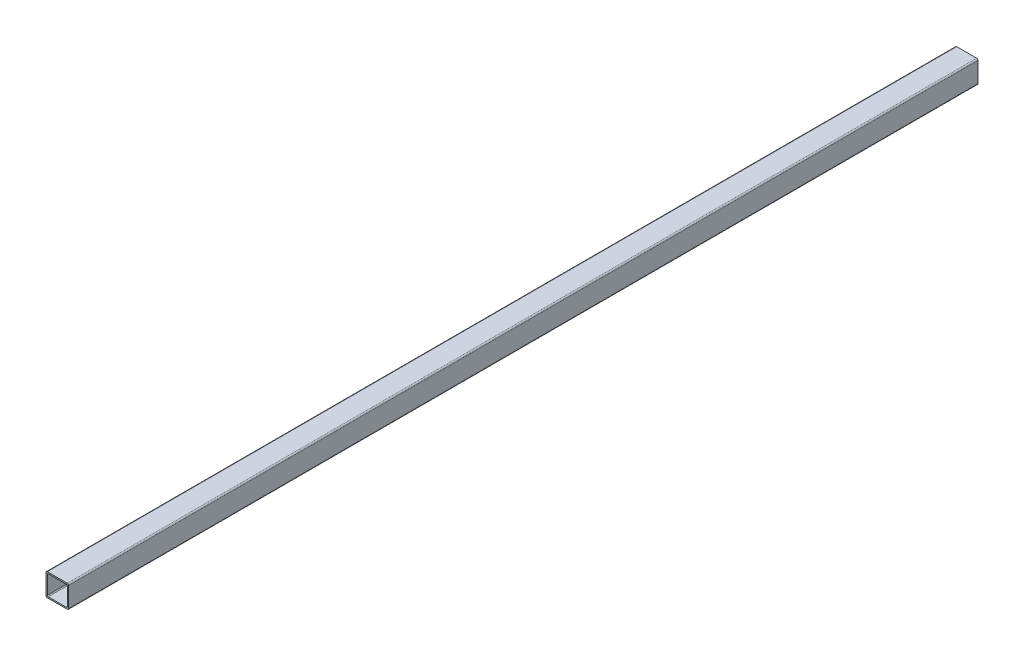
ISO-10303-21;
HEADER;
FILE_DESCRIPTION(('STEP AP214'),'2;1');
FILE_NAME('part.step','',(''),(''),'','','');
FILE_SCHEMA(('AUTOMOTIVE_DESIGN { 1 0 10303 214 1 1 1 1 }'));
ENDSEC;
DATA;
#1=APPLICATION_CONTEXT('core data for automotive mechanical design processes');
#2=APPLICATION_PROTOCOL_DEFINITION('international standard','automotive_design',2000,#1);
#3=PRODUCT_CONTEXT('',#1,'mechanical');
#4=PRODUCT('Part','Part','',(#3));
#5=PRODUCT_RELATED_PRODUCT_CATEGORY('part','',(#4));
#6=PRODUCT_DEFINITION_FORMATION('','',#4);
#7=PRODUCT_DEFINITION_CONTEXT('part definition',#1,'design');
#8=PRODUCT_DEFINITION('design','',#6,#7);
#9=PRODUCT_DEFINITION_SHAPE('','',#8);
#10=(LENGTH_UNIT() NAMED_UNIT(*) SI_UNIT(.MILLI.,.METRE.));
#11=(NAMED_UNIT(*) PLANE_ANGLE_UNIT() SI_UNIT($,.RADIAN.));
#12=(NAMED_UNIT(*) SI_UNIT($,.STERADIAN.) SOLID_ANGLE_UNIT());
#13=UNCERTAINTY_MEASURE_WITH_UNIT(LENGTH_MEASURE(1.E-05),#10,'distance_accuracy_value','');
#14=(GEOMETRIC_REPRESENTATION_CONTEXT(3) GLOBAL_UNCERTAINTY_ASSIGNED_CONTEXT((#13)) GLOBAL_UNIT_ASSIGNED_CONTEXT((#10,
#11,#12)) REPRESENTATION_CONTEXT('',''));
#15=CARTESIAN_POINT('',(0.,0.,0.));
#16=DIRECTION('',(0.,0.,1.));
#17=DIRECTION('',(1.,0.,0.));
#18=AXIS2_PLACEMENT_3D('',#15,#16,#17);
#19=CARTESIAN_POINT('',(-8.88178419700125E-13,93.9999999999994,4161.70432876125));
#20=DIRECTION('',(1.,0.,0.));
#21=DIRECTION('',(0.,0.,-1.));
#22=AXIS2_PLACEMENT_3D('',#19,#20,#21);
#23=PLANE('',#22);
#24=DIRECTION('',(0.,-1.,0.));
#25=VECTOR('',#24,1.);
#26=CARTESIAN_POINT('',(-8.88178419700125E-13,93.9999999999994,4020.28297252394));
#27=LINE('',#26,#25);
#28=CARTESIAN_POINT('',(-8.88178419700125E-13,93.9999999999994,4020.28297252394));
#29=VERTEX_POINT('',#28);
#30=CARTESIAN_POINT('',(-8.88178419700125E-13,5.99999999999945,4020.28297252394));
#31=VERTEX_POINT('',#30);
#32=EDGE_CURVE('E307',#29,#31,#27,.T.);
#33=ORIENTED_EDGE('',*,*,#32,.F.);
#34=DIRECTION('',(0.,0.,-1.));
#35=VECTOR('',#34,1.);
#36=CARTESIAN_POINT('',(-8.88178419700125E-13,93.9999999999994,4161.70432876125));
#37=LINE('',#36,#35);
#38=CARTESIAN_POINT('',(-8.88178419700125E-13,93.9999999999994,0.));
#39=VERTEX_POINT('',#38);
#40=EDGE_CURVE('E51',#29,#39,#37,.T.);
#41=ORIENTED_EDGE('',*,*,#40,.T.);
#42=DIRECTION('',(0.,-1.,0.));
#43=VECTOR('',#42,1.);
#44=CARTESIAN_POINT('',(-8.88178419700125E-13,93.9999999999994,0.));
#45=LINE('',#44,#43);
#46=CARTESIAN_POINT('',(-8.88178419700125E-13,5.99999999999945,0.));
#47=VERTEX_POINT('',#46);
#48=EDGE_CURVE('E202',#39,#47,#45,.T.);
#49=ORIENTED_EDGE('',*,*,#48,.T.);
#50=DIRECTION('',(0.,0.,-1.));
#51=VECTOR('',#50,1.);
#52=CARTESIAN_POINT('',(-8.88178419700125E-13,5.99999999999945,4161.70432876125));
#53=LINE('',#52,#51);
#54=EDGE_CURVE('E205',#31,#47,#53,.T.);
#55=ORIENTED_EDGE('',*,*,#54,.F.);
#56=EDGE_LOOP('',(#33,#41,#49,#55));
#57=FACE_BOUND('',#56,.T.);
#58=ADVANCED_FACE('F36',(#57),#23,.F.);
#59=CARTESIAN_POINT('',(5.99999999999934,93.9999999999994,4161.70432876125));
#60=DIRECTION('',(0.,0.,-1.));
#61=DIRECTION('',(-1.,0.,0.));
#62=AXIS2_PLACEMENT_3D('',#59,#60,#61);
#63=CYLINDRICAL_SURFACE('',#62,6.00000000000014);
#64=CARTESIAN_POINT('',(5.99999999999934,93.9999999999994,4020.28297252394));
#65=DIRECTION('',(0.,0.,1.));
#66=DIRECTION('',(1.,0.,0.));
#67=AXIS2_PLACEMENT_3D('',#64,#65,#66);
#68=CIRCLE('',#67,6.00000000000014);
#69=CARTESIAN_POINT('',(5.99999999999934,99.9999999999996,4020.28297252394));
#70=VERTEX_POINT('',#69);
#71=EDGE_CURVE('E243',#70,#29,#68,.T.);
#72=ORIENTED_EDGE('',*,*,#71,.F.);
#73=DIRECTION('',(0.,0.,-1.));
#74=VECTOR('',#73,1.);
#75=CARTESIAN_POINT('',(5.99999999999934,99.9999999999996,4161.70432876125));
#76=LINE('',#75,#74);
#77=CARTESIAN_POINT('',(5.99999999999934,99.9999999999996,0.));
#78=VERTEX_POINT('',#77);
#79=EDGE_CURVE('E208',#70,#78,#76,.T.);
#80=ORIENTED_EDGE('',*,*,#79,.T.);
#81=CARTESIAN_POINT('',(5.99999999999934,93.9999999999994,0.));
#82=DIRECTION('',(0.,0.,1.));
#83=DIRECTION('',(1.,0.,0.));
#84=AXIS2_PLACEMENT_3D('',#81,#82,#83);
#85=CIRCLE('',#84,6.00000000000014);
#86=EDGE_CURVE('E200',#78,#39,#85,.T.);
#87=ORIENTED_EDGE('',*,*,#86,.T.);
#88=ORIENTED_EDGE('',*,*,#40,.F.);
#89=EDGE_LOOP('',(#72,#80,#87,#88));
#90=FACE_BOUND('',#89,.T.);
#91=ADVANCED_FACE('F240',(#90),#63,.T.);
#92=CARTESIAN_POINT('',(5.99999999999934,99.9999999999995,4161.70432876125));
#93=DIRECTION('',(0.,-1.,0.));
#94=DIRECTION('',(0.,0.,-1.));
#95=AXIS2_PLACEMENT_3D('',#92,#93,#94);
#96=PLANE('',#95);
#97=DIRECTION('',(-1.,0.,0.));
#98=VECTOR('',#97,1.);
#99=CARTESIAN_POINT('',(5.99999999999934,99.9999999999995,4020.28297252394));
#100=LINE('',#99,#98);
#101=CARTESIAN_POINT('',(93.9999999999985,99.9999999999995,4020.28297252394));
#102=VERTEX_POINT('',#101);
#103=EDGE_CURVE('E248',#102,#70,#100,.T.);
#104=ORIENTED_EDGE('',*,*,#103,.F.);
#105=DIRECTION('',(0.,0.,-1.));
#106=VECTOR('',#105,1.);
#107=CARTESIAN_POINT('',(93.9999999999985,99.9999999999995,4161.70432876125));
#108=LINE('',#107,#106);
#109=CARTESIAN_POINT('',(93.9999999999985,99.9999999999995,0.));
#110=VERTEX_POINT('',#109);
#111=EDGE_CURVE('E210',#102,#110,#108,.T.);
#112=ORIENTED_EDGE('',*,*,#111,.T.);
#113=DIRECTION('',(-1.,0.,0.));
#114=VECTOR('',#113,1.);
#115=CARTESIAN_POINT('',(5.99999999999934,99.9999999999995,0.));
#116=LINE('',#115,#114);
#117=EDGE_CURVE('E197',#110,#78,#116,.T.);
#118=ORIENTED_EDGE('',*,*,#117,.T.);
#119=ORIENTED_EDGE('',*,*,#79,.F.);
#120=EDGE_LOOP('',(#104,#112,#118,#119));
#121=FACE_BOUND('',#120,.T.);
#122=ADVANCED_FACE('F246',(#121),#96,.F.);
#123=CARTESIAN_POINT('',(93.9999999999985,93.9999999999994,4161.70432876125));
#124=DIRECTION('',(0.,0.,-1.));
#125=DIRECTION('',(-1.,0.,0.));
#126=AXIS2_PLACEMENT_3D('',#123,#124,#125);
#127=CYLINDRICAL_SURFACE('',#126,6.00000000000014);
#128=CARTESIAN_POINT('',(93.9999999999985,93.9999999999994,4020.28297252394));
#129=DIRECTION('',(0.,0.,1.));
#130=DIRECTION('',(1.,0.,0.));
#131=AXIS2_PLACEMENT_3D('',#128,#129,#130);
#132=CIRCLE('',#131,6.00000000000014);
#133=CARTESIAN_POINT('',(99.9999999999987,93.9999999999994,4020.28297252394));
#134=VERTEX_POINT('',#133);
#135=EDGE_CURVE('E311',#134,#102,#132,.T.);
#136=ORIENTED_EDGE('',*,*,#135,.F.);
#137=DIRECTION('',(0.,0.,-1.));
#138=VECTOR('',#137,1.);
#139=CARTESIAN_POINT('',(99.9999999999987,93.9999999999994,4161.70432876125));
#140=LINE('',#139,#138);
#141=CARTESIAN_POINT('',(99.9999999999987,93.9999999999994,0.));
#142=VERTEX_POINT('',#141);
#143=EDGE_CURVE('E212',#134,#142,#140,.T.);
#144=ORIENTED_EDGE('',*,*,#143,.T.);
#145=CARTESIAN_POINT('',(93.9999999999985,93.9999999999994,0.));
#146=DIRECTION('',(0.,0.,1.));
#147=DIRECTION('',(-1.,0.,0.));
#148=AXIS2_PLACEMENT_3D('',#145,#146,#147);
#149=CIRCLE('',#148,6.00000000000014);
#150=EDGE_CURVE('E194',#142,#110,#149,.T.);
#151=ORIENTED_EDGE('',*,*,#150,.T.);
#152=ORIENTED_EDGE('',*,*,#111,.F.);
#153=EDGE_LOOP('',(#136,#144,#151,#152));
#154=FACE_BOUND('',#153,.T.);
#155=ADVANCED_FACE('F251',(#154),#127,.T.);
#156=CARTESIAN_POINT('',(99.9999999999987,93.9999999999994,4161.70432876125));
#157=DIRECTION('',(-1.,0.,0.));
#158=DIRECTION('',(0.,0.,1.));
#159=AXIS2_PLACEMENT_3D('',#156,#157,#158);
#160=PLANE('',#159);
#161=DIRECTION('',(0.,1.,0.));
#162=VECTOR('',#161,1.);
#163=CARTESIAN_POINT('',(99.9999999999987,93.9999999999994,4020.28297252394));
#164=LINE('',#163,#162);
#165=CARTESIAN_POINT('',(99.9999999999987,5.99999999999945,4020.28297252394));
#166=VERTEX_POINT('',#165);
#167=EDGE_CURVE('E257',#166,#134,#164,.T.);
#168=ORIENTED_EDGE('',*,*,#167,.F.);
#169=DIRECTION('',(0.,0.,-1.));
#170=VECTOR('',#169,1.);
#171=CARTESIAN_POINT('',(99.9999999999987,5.99999999999945,4161.70432876125));
#172=LINE('',#171,#170);
#173=CARTESIAN_POINT('',(99.9999999999987,5.99999999999945,0.));
#174=VERTEX_POINT('',#173);
#175=EDGE_CURVE('E214',#166,#174,#172,.T.);
#176=ORIENTED_EDGE('',*,*,#175,.T.);
#177=DIRECTION('',(0.,1.,0.));
#178=VECTOR('',#177,1.);
#179=CARTESIAN_POINT('',(99.9999999999987,93.9999999999994,0.));
#180=LINE('',#179,#178);
#181=EDGE_CURVE('E191',#174,#142,#180,.T.);
#182=ORIENTED_EDGE('',*,*,#181,.T.);
#183=ORIENTED_EDGE('',*,*,#143,.F.);
#184=EDGE_LOOP('',(#168,#176,#182,#183));
#185=FACE_BOUND('',#184,.T.);
#186=ADVANCED_FACE('F254',(#185),#160,.F.);
#187=CARTESIAN_POINT('',(93.9999999999985,5.99999999999945,4161.70432876125));
#188=DIRECTION('',(0.,0.,-1.));
#189=DIRECTION('',(-1.,0.,0.));
#190=AXIS2_PLACEMENT_3D('',#187,#188,#189);
#191=CYLINDRICAL_SURFACE('',#190,6.00000000000014);
#192=CARTESIAN_POINT('',(93.9999999999985,5.99999999999945,4020.28297252394));
#193=DIRECTION('',(0.,0.,1.));
#194=DIRECTION('',(1.,0.,0.));
#195=AXIS2_PLACEMENT_3D('',#192,#193,#194);
#196=CIRCLE('',#195,6.00000000000014);
#197=CARTESIAN_POINT('',(93.9999999999985,-6.93889390390723E-13,4020.28297252394));
#198=VERTEX_POINT('',#197);
#199=EDGE_CURVE('E261',#198,#166,#196,.T.);
#200=ORIENTED_EDGE('',*,*,#199,.F.);
#201=DIRECTION('',(0.,0.,-1.));
#202=VECTOR('',#201,1.);
#203=CARTESIAN_POINT('',(93.9999999999985,-6.93889390390723E-13,4161.70432876125));
#204=LINE('',#203,#202);
#205=CARTESIAN_POINT('',(93.9999999999985,-6.93889390390723E-13,0.));
#206=VERTEX_POINT('',#205);
#207=EDGE_CURVE('E216',#198,#206,#204,.T.);
#208=ORIENTED_EDGE('',*,*,#207,.T.);
#209=CARTESIAN_POINT('',(93.9999999999985,5.99999999999945,0.));
#210=DIRECTION('',(0.,0.,1.));
#211=DIRECTION('',(1.,0.,0.));
#212=AXIS2_PLACEMENT_3D('',#209,#210,#211);
#213=CIRCLE('',#212,6.00000000000014);
#214=EDGE_CURVE('E188',#206,#174,#213,.T.);
#215=ORIENTED_EDGE('',*,*,#214,.T.);
#216=ORIENTED_EDGE('',*,*,#175,.F.);
#217=EDGE_LOOP('',(#200,#208,#215,#216));
#218=FACE_BOUND('',#217,.T.);
#219=ADVANCED_FACE('F260',(#218),#191,.T.);
#220=CARTESIAN_POINT('',(5.99999999999934,-6.10622663543836E-13,4161.70432876125));
#221=DIRECTION('',(0.,1.,0.));
#222=DIRECTION('',(0.,0.,1.));
#223=AXIS2_PLACEMENT_3D('',#220,#221,#222);
#224=PLANE('',#223);
#225=DIRECTION('',(1.,0.,0.));
#226=VECTOR('',#225,1.);
#227=CARTESIAN_POINT('',(5.99999999999934,-6.10622663543836E-13,4020.28297252394));
#228=LINE('',#227,#226);
#229=CARTESIAN_POINT('',(5.99999999999934,-6.10622663543836E-13,4020.28297252394));
#230=VERTEX_POINT('',#229);
#231=EDGE_CURVE('E224',#230,#198,#228,.T.);
#232=ORIENTED_EDGE('',*,*,#231,.F.);
#233=DIRECTION('',(0.,0.,-1.));
#234=VECTOR('',#233,1.);
#235=CARTESIAN_POINT('',(5.99999999999934,-6.10622663543836E-13,4161.70432876125));
#236=LINE('',#235,#234);
#237=CARTESIAN_POINT('',(5.99999999999934,-6.10622663543836E-13,0.));
#238=VERTEX_POINT('',#237);
#239=EDGE_CURVE('E44',#230,#238,#236,.T.);
#240=ORIENTED_EDGE('',*,*,#239,.T.);
#241=DIRECTION('',(1.,0.,0.));
#242=VECTOR('',#241,1.);
#243=CARTESIAN_POINT('',(5.99999999999934,-6.10622663543836E-13,0.));
#244=LINE('',#243,#242);
#245=EDGE_CURVE('E185',#238,#206,#244,.T.);
#246=ORIENTED_EDGE('',*,*,#245,.T.);
#247=ORIENTED_EDGE('',*,*,#207,.F.);
#248=EDGE_LOOP('',(#232,#240,#246,#247));
#249=FACE_BOUND('',#248,.T.);
#250=ADVANCED_FACE('F220',(#249),#224,.F.);
#251=CARTESIAN_POINT('',(5.99999999999934,5.99999999999945,4161.70432876125));
#252=DIRECTION('',(0.,0.,-1.));
#253=DIRECTION('',(-1.,0.,0.));
#254=AXIS2_PLACEMENT_3D('',#251,#252,#253);
#255=CYLINDRICAL_SURFACE('',#254,6.00000000000014);
#256=CARTESIAN_POINT('',(5.99999999999934,5.99999999999945,4020.28297252394));
#257=DIRECTION('',(0.,0.,1.));
#258=DIRECTION('',(1.,0.,0.));
#259=AXIS2_PLACEMENT_3D('',#256,#257,#258);
#260=CIRCLE('',#259,6.00000000000014);
#261=EDGE_CURVE('E234',#31,#230,#260,.T.);
#262=ORIENTED_EDGE('',*,*,#261,.F.);
#263=ORIENTED_EDGE('',*,*,#54,.T.);
#264=CARTESIAN_POINT('',(5.99999999999934,5.99999999999945,0.));
#265=DIRECTION('',(0.,0.,1.));
#266=DIRECTION('',(1.,0.,0.));
#267=AXIS2_PLACEMENT_3D('',#264,#265,#266);
#268=CIRCLE('',#267,6.00000000000014);
#269=EDGE_CURVE('E182',#47,#238,#268,.T.);
#270=ORIENTED_EDGE('',*,*,#269,.T.);
#271=ORIENTED_EDGE('',*,*,#239,.F.);
#272=EDGE_LOOP('',(#262,#263,#270,#271));
#273=FACE_BOUND('',#272,.T.);
#274=ADVANCED_FACE('F38',(#273),#255,.T.);
#275=CARTESIAN_POINT('',(5.99999999999934,5.99999999999945,0.));
#276=DIRECTION('',(0.,0.,1.));
#277=DIRECTION('',(1.,0.,0.));
#278=AXIS2_PLACEMENT_3D('',#275,#276,#277);
#279=PLANE('',#278);
#280=ORIENTED_EDGE('',*,*,#269,.F.);
#281=ORIENTED_EDGE('',*,*,#48,.F.);
#282=ORIENTED_EDGE('',*,*,#86,.F.);
#283=ORIENTED_EDGE('',*,*,#117,.F.);
#284=ORIENTED_EDGE('',*,*,#150,.F.);
#285=ORIENTED_EDGE('',*,*,#181,.F.);
#286=ORIENTED_EDGE('',*,*,#214,.F.);
#287=ORIENTED_EDGE('',*,*,#245,.F.);
#288=EDGE_LOOP('',(#280,#281,#282,#283,#284,#285,#286,#287));
#289=FACE_BOUND('',#288,.T.);
#290=CARTESIAN_POINT('',(9.99999999999801,9.99999999999945,0.));
#291=DIRECTION('',(0.,0.,1.));
#292=DIRECTION('',(1.,0.,0.));
#293=AXIS2_PLACEMENT_3D('',#290,#291,#292);
#294=CIRCLE('',#293,3.99999999999978);
#295=CARTESIAN_POINT('',(5.99999999999845,9.99999999999945,0.));
#296=VERTEX_POINT('',#295);
#297=CARTESIAN_POINT('',(9.99999999999801,5.99999999999945,0.));
#298=VERTEX_POINT('',#297);
#299=EDGE_CURVE('E263',#296,#298,#294,.T.);
#300=ORIENTED_EDGE('',*,*,#299,.T.);
#301=DIRECTION('',(1.,0.,0.));
#302=VECTOR('',#301,1.);
#303=CARTESIAN_POINT('',(9.99999999999801,5.99999999999945,0.));
#304=LINE('',#303,#302);
#305=CARTESIAN_POINT('',(89.9999999999999,5.99999999999967,0.));
#306=VERTEX_POINT('',#305);
#307=EDGE_CURVE('E270',#298,#306,#304,.T.);
#308=ORIENTED_EDGE('',*,*,#307,.T.);
#309=CARTESIAN_POINT('',(89.9999999999999,9.99999999999945,0.));
#310=DIRECTION('',(0.,0.,1.));
#311=DIRECTION('',(1.,0.,0.));
#312=AXIS2_PLACEMENT_3D('',#309,#310,#311);
#313=CIRCLE('',#312,3.99999999999978);
#314=CARTESIAN_POINT('',(93.9999999999994,9.99999999999945,0.));
#315=VERTEX_POINT('',#314);
#316=EDGE_CURVE('E273',#306,#315,#313,.T.);
#317=ORIENTED_EDGE('',*,*,#316,.T.);
#318=DIRECTION('',(0.,1.,0.));
#319=VECTOR('',#318,1.);
#320=CARTESIAN_POINT('',(93.9999999999994,89.9999999999994,0.));
#321=LINE('',#320,#319);
#322=CARTESIAN_POINT('',(93.9999999999996,89.9999999999994,0.));
#323=VERTEX_POINT('',#322);
#324=EDGE_CURVE('E276',#315,#323,#321,.T.);
#325=ORIENTED_EDGE('',*,*,#324,.T.);
#326=CARTESIAN_POINT('',(89.9999999999999,89.9999999999994,0.));
#327=DIRECTION('',(0.,0.,1.));
#328=DIRECTION('',(-1.,0.,0.));
#329=AXIS2_PLACEMENT_3D('',#326,#327,#328);
#330=CIRCLE('',#329,3.99999999999978);
#331=CARTESIAN_POINT('',(89.9999999999999,93.9999999999994,0.));
#332=VERTEX_POINT('',#331);
#333=EDGE_CURVE('E279',#323,#332,#330,.T.);
#334=ORIENTED_EDGE('',*,*,#333,.T.);
#335=DIRECTION('',(-1.,0.,0.));
#336=VECTOR('',#335,1.);
#337=CARTESIAN_POINT('',(9.99999999999801,93.9999999999994,0.));
#338=LINE('',#337,#336);
#339=CARTESIAN_POINT('',(9.99999999999801,93.9999999999992,0.));
#340=VERTEX_POINT('',#339);
#341=EDGE_CURVE('E282',#332,#340,#338,.T.);
#342=ORIENTED_EDGE('',*,*,#341,.T.);
#343=CARTESIAN_POINT('',(9.99999999999801,89.9999999999994,0.));
#344=DIRECTION('',(0.,0.,1.));
#345=DIRECTION('',(1.,0.,0.));
#346=AXIS2_PLACEMENT_3D('',#343,#344,#345);
#347=CIRCLE('',#346,3.99999999999978);
#348=CARTESIAN_POINT('',(5.99999999999845,89.9999999999994,0.));
#349=VERTEX_POINT('',#348);
#350=EDGE_CURVE('E285',#340,#349,#347,.T.);
#351=ORIENTED_EDGE('',*,*,#350,.T.);
#352=DIRECTION('',(0.,-1.,0.));
#353=VECTOR('',#352,1.);
#354=CARTESIAN_POINT('',(5.99999999999845,89.9999999999994,0.));
#355=LINE('',#354,#353);
#356=EDGE_CURVE('E164',#349,#296,#355,.T.);
#357=ORIENTED_EDGE('',*,*,#356,.T.);
#358=EDGE_LOOP('',(#300,#308,#317,#325,#334,#342,#351,#357));
#359=FACE_BOUND('',#358,.T.);
#360=ADVANCED_FACE('F230',(#289,#359),#279,.F.);
#361=CARTESIAN_POINT('',(5.99999999999845,89.9999999999994,4161.70432876125));
#362=DIRECTION('',(1.,0.,0.));
#363=DIRECTION('',(0.,0.,-1.));
#364=AXIS2_PLACEMENT_3D('',#361,#362,#363);
#365=PLANE('',#364);
#366=DIRECTION('',(0.,0.,-1.));
#367=VECTOR('',#366,1.);
#368=CARTESIAN_POINT('',(5.99999999999845,89.9999999999994,4161.70432876125));
#369=LINE('',#368,#367);
#370=CARTESIAN_POINT('',(5.99999999999845,89.9999999999994,4020.28297252394));
#371=VERTEX_POINT('',#370);
#372=EDGE_CURVE('E156',#371,#349,#369,.T.);
#373=ORIENTED_EDGE('',*,*,#372,.F.);
#374=DIRECTION('',(0.,-1.,0.));
#375=VECTOR('',#374,1.);
#376=CARTESIAN_POINT('',(5.99999999999845,89.9999999999994,4020.28297252394));
#377=LINE('',#376,#375);
#378=CARTESIAN_POINT('',(5.99999999999845,9.99999999999945,4020.28297252394));
#379=VERTEX_POINT('',#378);
#380=EDGE_CURVE('E11',#371,#379,#377,.T.);
#381=ORIENTED_EDGE('',*,*,#380,.T.);
#382=DIRECTION('',(0.,0.,-1.));
#383=VECTOR('',#382,1.);
#384=CARTESIAN_POINT('',(5.99999999999845,9.99999999999945,4161.70432876125));
#385=LINE('',#384,#383);
#386=EDGE_CURVE('E166',#379,#296,#385,.T.);
#387=ORIENTED_EDGE('',*,*,#386,.T.);
#388=ORIENTED_EDGE('',*,*,#356,.F.);
#389=EDGE_LOOP('',(#373,#381,#387,#388));
#390=FACE_BOUND('',#389,.T.);
#391=ADVANCED_FACE('F162',(#390),#365,.T.);
#392=CARTESIAN_POINT('',(9.99999999999801,89.9999999999994,4161.70432876125));
#393=DIRECTION('',(0.,0.,-1.));
#394=DIRECTION('',(-1.,0.,0.));
#395=AXIS2_PLACEMENT_3D('',#392,#393,#394);
#396=CYLINDRICAL_SURFACE('',#395,3.99999999999978);
#397=DIRECTION('',(0.,0.,-1.));
#398=VECTOR('',#397,1.);
#399=CARTESIAN_POINT('',(9.99999999999801,93.9999999999992,4161.70432876125));
#400=LINE('',#399,#398);
#401=CARTESIAN_POINT('',(9.99999999999801,93.9999999999992,4020.28297252394));
#402=VERTEX_POINT('',#401);
#403=EDGE_CURVE('E158',#402,#340,#400,.T.);
#404=ORIENTED_EDGE('',*,*,#403,.F.);
#405=CARTESIAN_POINT('',(9.99999999999801,89.9999999999994,4020.28297252394));
#406=DIRECTION('',(0.,0.,1.));
#407=DIRECTION('',(1.,0.,0.));
#408=AXIS2_PLACEMENT_3D('',#405,#406,#407);
#409=CIRCLE('',#408,3.99999999999978);
#410=EDGE_CURVE('E149',#402,#371,#409,.T.);
#411=ORIENTED_EDGE('',*,*,#410,.T.);
#412=ORIENTED_EDGE('',*,*,#372,.T.);
#413=ORIENTED_EDGE('',*,*,#350,.F.);
#414=EDGE_LOOP('',(#404,#411,#412,#413));
#415=FACE_BOUND('',#414,.T.);
#416=ADVANCED_FACE('F154',(#415),#396,.F.);
#417=CARTESIAN_POINT('',(9.99999999999801,93.9999999999994,4161.70432876125));
#418=DIRECTION('',(0.,-1.,0.));
#419=DIRECTION('',(0.,0.,-1.));
#420=AXIS2_PLACEMENT_3D('',#417,#418,#419);
#421=PLANE('',#420);
#422=DIRECTION('',(0.,0.,-1.));
#423=VECTOR('',#422,1.);
#424=CARTESIAN_POINT('',(89.9999999999999,93.9999999999994,4161.70432876125));
#425=LINE('',#424,#423);
#426=CARTESIAN_POINT('',(89.9999999999999,93.9999999999994,4020.28297252394));
#427=VERTEX_POINT('',#426);
#428=EDGE_CURVE('E168',#427,#332,#425,.T.);
#429=ORIENTED_EDGE('',*,*,#428,.F.);
#430=DIRECTION('',(-1.,0.,0.));
#431=VECTOR('',#430,1.);
#432=CARTESIAN_POINT('',(9.99999999999801,93.9999999999994,4020.28297252394));
#433=LINE('',#432,#431);
#434=EDGE_CURVE('E160',#427,#402,#433,.T.);
#435=ORIENTED_EDGE('',*,*,#434,.T.);
#436=ORIENTED_EDGE('',*,*,#403,.T.);
#437=ORIENTED_EDGE('',*,*,#341,.F.);
#438=EDGE_LOOP('',(#429,#435,#436,#437));
#439=FACE_BOUND('',#438,.T.);
#440=ADVANCED_FACE('F291',(#439),#421,.T.);
#441=CARTESIAN_POINT('',(89.9999999999999,89.9999999999994,4161.70432876125));
#442=DIRECTION('',(0.,0.,-1.));
#443=DIRECTION('',(-1.,0.,0.));
#444=AXIS2_PLACEMENT_3D('',#441,#442,#443);
#445=CYLINDRICAL_SURFACE('',#444,3.99999999999978);
#446=DIRECTION('',(0.,0.,-1.));
#447=VECTOR('',#446,1.);
#448=CARTESIAN_POINT('',(93.9999999999996,89.9999999999994,4161.70432876125));
#449=LINE('',#448,#447);
#450=CARTESIAN_POINT('',(93.9999999999996,89.9999999999994,4020.28297252394));
#451=VERTEX_POINT('',#450);
#452=EDGE_CURVE('E174',#451,#323,#449,.T.);
#453=ORIENTED_EDGE('',*,*,#452,.F.);
#454=CARTESIAN_POINT('',(89.9999999999999,89.9999999999994,4020.28297252394));
#455=DIRECTION('',(0.,0.,1.));
#456=DIRECTION('',(1.,0.,0.));
#457=AXIS2_PLACEMENT_3D('',#454,#455,#456);
#458=CIRCLE('',#457,3.99999999999978);
#459=EDGE_CURVE('E293',#451,#427,#458,.T.);
#460=ORIENTED_EDGE('',*,*,#459,.T.);
#461=ORIENTED_EDGE('',*,*,#428,.T.);
#462=ORIENTED_EDGE('',*,*,#333,.F.);
#463=EDGE_LOOP('',(#453,#460,#461,#462));
#464=FACE_BOUND('',#463,.T.);
#465=ADVANCED_FACE('F328',(#464),#445,.F.);
#466=CARTESIAN_POINT('',(93.9999999999994,89.9999999999994,4161.70432876125));
#467=DIRECTION('',(-1.,0.,0.));
#468=DIRECTION('',(0.,0.,1.));
#469=AXIS2_PLACEMENT_3D('',#466,#467,#468);
#470=PLANE('',#469);
#471=DIRECTION('',(0.,0.,-1.));
#472=VECTOR('',#471,1.);
#473=CARTESIAN_POINT('',(93.9999999999994,9.99999999999945,4161.70432876125));
#474=LINE('',#473,#472);
#475=CARTESIAN_POINT('',(93.9999999999994,9.99999999999945,4020.28297252394));
#476=VERTEX_POINT('',#475);
#477=EDGE_CURVE('E176',#476,#315,#474,.T.);
#478=ORIENTED_EDGE('',*,*,#477,.F.);
#479=DIRECTION('',(0.,1.,0.));
#480=VECTOR('',#479,1.);
#481=CARTESIAN_POINT('',(93.9999999999994,89.9999999999994,4020.28297252394));
#482=LINE('',#481,#480);
#483=EDGE_CURVE('E295',#476,#451,#482,.T.);
#484=ORIENTED_EDGE('',*,*,#483,.T.);
#485=ORIENTED_EDGE('',*,*,#452,.T.);
#486=ORIENTED_EDGE('',*,*,#324,.F.);
#487=EDGE_LOOP('',(#478,#484,#485,#486));
#488=FACE_BOUND('',#487,.T.);
#489=ADVANCED_FACE('F325',(#488),#470,.T.);
#490=CARTESIAN_POINT('',(89.9999999999999,9.99999999999945,4161.70432876125));
#491=DIRECTION('',(0.,0.,-1.));
#492=DIRECTION('',(-1.,0.,0.));
#493=AXIS2_PLACEMENT_3D('',#490,#491,#492);
#494=CYLINDRICAL_SURFACE('',#493,3.99999999999978);
#495=DIRECTION('',(0.,0.,-1.));
#496=VECTOR('',#495,1.);
#497=CARTESIAN_POINT('',(89.9999999999999,5.99999999999967,4161.70432876125));
#498=LINE('',#497,#496);
#499=CARTESIAN_POINT('',(89.9999999999999,5.99999999999967,4020.28297252394));
#500=VERTEX_POINT('',#499);
#501=EDGE_CURVE('E178',#500,#306,#498,.T.);
#502=ORIENTED_EDGE('',*,*,#501,.F.);
#503=CARTESIAN_POINT('',(89.9999999999999,9.99999999999945,4020.28297252394));
#504=DIRECTION('',(0.,0.,1.));
#505=DIRECTION('',(1.,0.,0.));
#506=AXIS2_PLACEMENT_3D('',#503,#504,#505);
#507=CIRCLE('',#506,3.99999999999978);
#508=EDGE_CURVE('E300',#500,#476,#507,.T.);
#509=ORIENTED_EDGE('',*,*,#508,.T.);
#510=ORIENTED_EDGE('',*,*,#477,.T.);
#511=ORIENTED_EDGE('',*,*,#316,.F.);
#512=EDGE_LOOP('',(#502,#509,#510,#511));
#513=FACE_BOUND('',#512,.T.);
#514=ADVANCED_FACE('F322',(#513),#494,.F.);
#515=CARTESIAN_POINT('',(9.99999999999801,5.99999999999945,4161.70432876125));
#516=DIRECTION('',(0.,1.,0.));
#517=DIRECTION('',(0.,0.,1.));
#518=AXIS2_PLACEMENT_3D('',#515,#516,#517);
#519=PLANE('',#518);
#520=DIRECTION('',(0.,0.,-1.));
#521=VECTOR('',#520,1.);
#522=CARTESIAN_POINT('',(9.99999999999801,5.99999999999945,4161.70432876125));
#523=LINE('',#522,#521);
#524=CARTESIAN_POINT('',(9.99999999999801,5.99999999999945,4020.28297252394));
#525=VERTEX_POINT('',#524);
#526=EDGE_CURVE('E180',#525,#298,#523,.T.);
#527=ORIENTED_EDGE('',*,*,#526,.F.);
#528=DIRECTION('',(1.,0.,0.));
#529=VECTOR('',#528,1.);
#530=CARTESIAN_POINT('',(9.99999999999801,5.99999999999945,4020.28297252394));
#531=LINE('',#530,#529);
#532=EDGE_CURVE('E303',#525,#500,#531,.T.);
#533=ORIENTED_EDGE('',*,*,#532,.T.);
#534=ORIENTED_EDGE('',*,*,#501,.T.);
#535=ORIENTED_EDGE('',*,*,#307,.F.);
#536=EDGE_LOOP('',(#527,#533,#534,#535));
#537=FACE_BOUND('',#536,.T.);
#538=ADVANCED_FACE('F317',(#537),#519,.T.);
#539=CARTESIAN_POINT('',(9.99999999999801,9.99999999999945,4161.70432876125));
#540=DIRECTION('',(0.,0.,-1.));
#541=DIRECTION('',(-1.,0.,0.));
#542=AXIS2_PLACEMENT_3D('',#539,#540,#541);
#543=CYLINDRICAL_SURFACE('',#542,3.99999999999978);
#544=ORIENTED_EDGE('',*,*,#386,.F.);
#545=CARTESIAN_POINT('',(9.99999999999801,9.99999999999945,4020.28297252394));
#546=DIRECTION('',(0.,0.,1.));
#547=DIRECTION('',(1.,0.,0.));
#548=AXIS2_PLACEMENT_3D('',#545,#546,#547);
#549=CIRCLE('',#548,3.99999999999978);
#550=EDGE_CURVE('E59',#379,#525,#549,.T.);
#551=ORIENTED_EDGE('',*,*,#550,.T.);
#552=ORIENTED_EDGE('',*,*,#526,.T.);
#553=ORIENTED_EDGE('',*,*,#299,.F.);
#554=EDGE_LOOP('',(#544,#551,#552,#553));
#555=FACE_BOUND('',#554,.T.);
#556=ADVANCED_FACE('F313',(#555),#543,.F.);
#557=CARTESIAN_POINT('',(-1041.42135623731,93.9999999999995,4020.28297252394));
#558=DIRECTION('',(0.,0.,1.));
#559=DIRECTION('',(1.,0.,0.));
#560=AXIS2_PLACEMENT_3D('',#557,#558,#559);
#561=PLANE('',#560);
#562=ORIENTED_EDGE('',*,*,#550,.F.);
#563=ORIENTED_EDGE('',*,*,#380,.F.);
#564=ORIENTED_EDGE('',*,*,#410,.F.);
#565=ORIENTED_EDGE('',*,*,#434,.F.);
#566=ORIENTED_EDGE('',*,*,#459,.F.);
#567=ORIENTED_EDGE('',*,*,#483,.F.);
#568=ORIENTED_EDGE('',*,*,#508,.F.);
#569=ORIENTED_EDGE('',*,*,#532,.F.);
#570=EDGE_LOOP('',(#562,#563,#564,#565,#566,#567,#568,#569));
#571=FACE_BOUND('',#570,.T.);
#572=ORIENTED_EDGE('',*,*,#32,.T.);
#573=ORIENTED_EDGE('',*,*,#261,.T.);
#574=ORIENTED_EDGE('',*,*,#231,.T.);
#575=ORIENTED_EDGE('',*,*,#199,.T.);
#576=ORIENTED_EDGE('',*,*,#167,.T.);
#577=ORIENTED_EDGE('',*,*,#135,.T.);
#578=ORIENTED_EDGE('',*,*,#103,.T.);
#579=ORIENTED_EDGE('',*,*,#71,.T.);
#580=EDGE_LOOP('',(#572,#573,#574,#575,#576,#577,#578,#579));
#581=FACE_BOUND('',#580,.T.);
#582=ADVANCED_FACE('F147',(#571,#581),#561,.T.);
#583=CLOSED_SHELL('',(#58,#91,#122,#155,#186,#219,#250,#274,#360,#391,#416,#440,#465,#489,#514,
#538,#556,#582));
#584=MANIFOLD_SOLID_BREP('B2',#583);
#585=ADVANCED_BREP_SHAPE_REPRESENTATION('',(#18,#584),#14);
#586=SHAPE_DEFINITION_REPRESENTATION(#9,#585);
ENDSEC;
END-ISO-10303-21;
